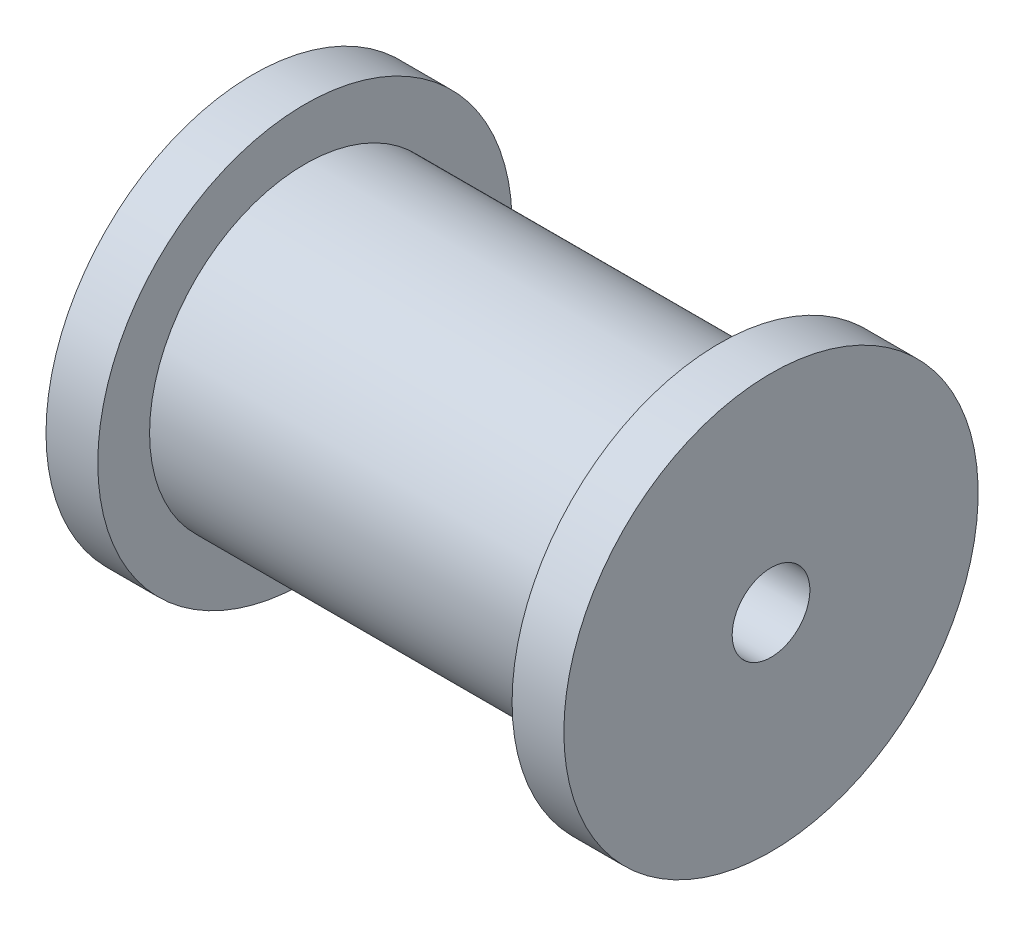
ISO-10303-21;
HEADER;
FILE_DESCRIPTION(('STEP AP214'),'2;1');
FILE_NAME('part.step','',(''),(''),'','','');
FILE_SCHEMA(('AUTOMOTIVE_DESIGN { 1 0 10303 214 1 1 1 1 }'));
ENDSEC;
DATA;
#1=APPLICATION_CONTEXT('core data for automotive mechanical design processes');
#2=APPLICATION_PROTOCOL_DEFINITION('international standard','automotive_design',2000,#1);
#3=PRODUCT_CONTEXT('',#1,'mechanical');
#4=PRODUCT('Part','Part','',(#3));
#5=PRODUCT_RELATED_PRODUCT_CATEGORY('part','',(#4));
#6=PRODUCT_DEFINITION_FORMATION('','',#4);
#7=PRODUCT_DEFINITION_CONTEXT('part definition',#1,'design');
#8=PRODUCT_DEFINITION('design','',#6,#7);
#9=PRODUCT_DEFINITION_SHAPE('','',#8);
#10=(LENGTH_UNIT() NAMED_UNIT(*) SI_UNIT(.MILLI.,.METRE.));
#11=(NAMED_UNIT(*) PLANE_ANGLE_UNIT() SI_UNIT($,.RADIAN.));
#12=(NAMED_UNIT(*) SI_UNIT($,.STERADIAN.) SOLID_ANGLE_UNIT());
#13=UNCERTAINTY_MEASURE_WITH_UNIT(LENGTH_MEASURE(1.E-05),#10,'distance_accuracy_value','');
#14=(GEOMETRIC_REPRESENTATION_CONTEXT(3) GLOBAL_UNCERTAINTY_ASSIGNED_CONTEXT((#13)) GLOBAL_UNIT_ASSIGNED_CONTEXT((#10,
#11,#12)) REPRESENTATION_CONTEXT('',''));
#15=CARTESIAN_POINT('',(0.,0.,0.));
#16=DIRECTION('',(0.,0.,1.));
#17=DIRECTION('',(1.,0.,0.));
#18=AXIS2_PLACEMENT_3D('',#15,#16,#17);
#19=CARTESIAN_POINT('',(6.35,0.,0.));
#20=DIRECTION('',(-1.,0.,0.));
#21=DIRECTION('',(0.,0.,-1.));
#22=AXIS2_PLACEMENT_3D('',#19,#20,#21);
#23=CYLINDRICAL_SURFACE('',#22,25.4);
#24=CARTESIAN_POINT('',(6.35,0.,0.));
#25=DIRECTION('',(-1.,0.,0.));
#26=DIRECTION('',(0.,0.,1.));
#27=AXIS2_PLACEMENT_3D('',#24,#25,#26);
#28=CIRCLE('',#27,25.4);
#29=CARTESIAN_POINT('',(6.35,0.,25.4));
#30=VERTEX_POINT('',#29);
#31=EDGE_CURVE('E10',#30,#30,#28,.T.);
#32=ORIENTED_EDGE('',*,*,#31,.T.);
#33=EDGE_LOOP('',(#32));
#34=FACE_BOUND('',#33,.T.);
#35=CARTESIAN_POINT('',(0.,0.,0.));
#36=DIRECTION('',(-1.,0.,0.));
#37=DIRECTION('',(0.,0.,1.));
#38=AXIS2_PLACEMENT_3D('',#35,#36,#37);
#39=CIRCLE('',#38,25.4);
#40=CARTESIAN_POINT('',(0.,0.,25.4));
#41=VERTEX_POINT('',#40);
#42=EDGE_CURVE('E34',#41,#41,#39,.T.);
#43=ORIENTED_EDGE('',*,*,#42,.F.);
#44=EDGE_LOOP('',(#43));
#45=FACE_BOUND('',#44,.T.);
#46=ADVANCED_FACE('F31',(#34,#45),#23,.T.);
#47=CARTESIAN_POINT('',(6.35,0.,0.));
#48=DIRECTION('',(1.,0.,0.));
#49=DIRECTION('',(0.,0.,1.));
#50=AXIS2_PLACEMENT_3D('',#47,#48,#49);
#51=PLANE('',#50);
#52=CARTESIAN_POINT('',(6.35,0.,0.));
#53=DIRECTION('',(-1.,0.,0.));
#54=DIRECTION('',(0.,0.,1.));
#55=AXIS2_PLACEMENT_3D('',#52,#53,#54);
#56=CIRCLE('',#55,19.05);
#57=CARTESIAN_POINT('',(6.35,0.,19.05));
#58=VERTEX_POINT('',#57);
#59=EDGE_CURVE('E43',#58,#58,#56,.T.);
#60=ORIENTED_EDGE('',*,*,#59,.T.);
#61=EDGE_LOOP('',(#60));
#62=FACE_BOUND('',#61,.T.);
#63=ORIENTED_EDGE('',*,*,#31,.F.);
#64=EDGE_LOOP('',(#63));
#65=FACE_BOUND('',#64,.T.);
#66=ADVANCED_FACE('F68',(#62,#65),#51,.T.);
#67=CARTESIAN_POINT('',(0.,0.,0.));
#68=DIRECTION('',(1.,0.,0.));
#69=DIRECTION('',(0.,0.,1.));
#70=AXIS2_PLACEMENT_3D('',#67,#68,#69);
#71=PLANE('',#70);
#72=CARTESIAN_POINT('',(0.,0.,0.));
#73=DIRECTION('',(-1.,0.,0.));
#74=DIRECTION('',(0.,0.,1.));
#75=AXIS2_PLACEMENT_3D('',#72,#73,#74);
#76=CIRCLE('',#75,4.7625);
#77=CARTESIAN_POINT('',(0.,0.,4.7625));
#78=VERTEX_POINT('',#77);
#79=EDGE_CURVE('E52',#78,#78,#76,.T.);
#80=ORIENTED_EDGE('',*,*,#79,.F.);
#81=EDGE_LOOP('',(#80));
#82=FACE_BOUND('',#81,.T.);
#83=ORIENTED_EDGE('',*,*,#42,.T.);
#84=EDGE_LOOP('',(#83));
#85=FACE_BOUND('',#84,.T.);
#86=ADVANCED_FACE('F64',(#82,#85),#71,.F.);
#87=CARTESIAN_POINT('',(57.15,0.,0.));
#88=DIRECTION('',(-1.,0.,0.));
#89=DIRECTION('',(0.,0.,-1.));
#90=AXIS2_PLACEMENT_3D('',#87,#88,#89);
#91=CYLINDRICAL_SURFACE('',#90,19.05);
#92=CARTESIAN_POINT('',(57.15,0.,0.));
#93=DIRECTION('',(-1.,0.,0.));
#94=DIRECTION('',(0.,0.,1.));
#95=AXIS2_PLACEMENT_3D('',#92,#93,#94);
#96=CIRCLE('',#95,19.05);
#97=CARTESIAN_POINT('',(57.15,0.,19.05));
#98=VERTEX_POINT('',#97);
#99=EDGE_CURVE('E41',#98,#98,#96,.T.);
#100=ORIENTED_EDGE('',*,*,#99,.T.);
#101=EDGE_LOOP('',(#100));
#102=FACE_BOUND('',#101,.T.);
#103=ORIENTED_EDGE('',*,*,#59,.F.);
#104=EDGE_LOOP('',(#103));
#105=FACE_BOUND('',#104,.T.);
#106=ADVANCED_FACE('F67',(#102,#105),#91,.T.);
#107=CARTESIAN_POINT('',(63.5,0.,0.));
#108=DIRECTION('',(-1.,0.,0.));
#109=DIRECTION('',(0.,0.,-1.));
#110=AXIS2_PLACEMENT_3D('',#107,#108,#109);
#111=CYLINDRICAL_SURFACE('',#110,25.4);
#112=CARTESIAN_POINT('',(63.5,0.,0.));
#113=DIRECTION('',(-1.,0.,0.));
#114=DIRECTION('',(0.,0.,1.));
#115=AXIS2_PLACEMENT_3D('',#112,#113,#114);
#116=CIRCLE('',#115,25.4);
#117=CARTESIAN_POINT('',(63.5,0.,25.4));
#118=VERTEX_POINT('',#117);
#119=EDGE_CURVE('E46',#118,#118,#116,.T.);
#120=ORIENTED_EDGE('',*,*,#119,.T.);
#121=EDGE_LOOP('',(#120));
#122=FACE_BOUND('',#121,.T.);
#123=CARTESIAN_POINT('',(57.15,0.,0.));
#124=DIRECTION('',(-1.,0.,0.));
#125=DIRECTION('',(0.,0.,1.));
#126=AXIS2_PLACEMENT_3D('',#123,#124,#125);
#127=CIRCLE('',#126,25.4);
#128=CARTESIAN_POINT('',(57.15,0.,25.4));
#129=VERTEX_POINT('',#128);
#130=EDGE_CURVE('E49',#129,#129,#127,.T.);
#131=ORIENTED_EDGE('',*,*,#130,.F.);
#132=EDGE_LOOP('',(#131));
#133=FACE_BOUND('',#132,.T.);
#134=ADVANCED_FACE('F83',(#122,#133),#111,.T.);
#135=CARTESIAN_POINT('',(63.5,0.,0.));
#136=DIRECTION('',(1.,0.,0.));
#137=DIRECTION('',(0.,0.,1.));
#138=AXIS2_PLACEMENT_3D('',#135,#136,#137);
#139=PLANE('',#138);
#140=CARTESIAN_POINT('',(63.5,0.,0.));
#141=DIRECTION('',(-1.,0.,0.));
#142=DIRECTION('',(0.,0.,1.));
#143=AXIS2_PLACEMENT_3D('',#140,#141,#142);
#144=CIRCLE('',#143,4.7625);
#145=CARTESIAN_POINT('',(63.5,0.,4.7625));
#146=VERTEX_POINT('',#145);
#147=EDGE_CURVE('E55',#146,#146,#144,.T.);
#148=ORIENTED_EDGE('',*,*,#147,.T.);
#149=EDGE_LOOP('',(#148));
#150=FACE_BOUND('',#149,.T.);
#151=ORIENTED_EDGE('',*,*,#119,.F.);
#152=EDGE_LOOP('',(#151));
#153=FACE_BOUND('',#152,.T.);
#154=ADVANCED_FACE('F87',(#150,#153),#139,.T.);
#155=CARTESIAN_POINT('',(57.15,0.,0.));
#156=DIRECTION('',(1.,0.,0.));
#157=DIRECTION('',(0.,0.,1.));
#158=AXIS2_PLACEMENT_3D('',#155,#156,#157);
#159=PLANE('',#158);
#160=ORIENTED_EDGE('',*,*,#99,.F.);
#161=EDGE_LOOP('',(#160));
#162=FACE_BOUND('',#161,.T.);
#163=ORIENTED_EDGE('',*,*,#130,.T.);
#164=EDGE_LOOP('',(#163));
#165=FACE_BOUND('',#164,.T.);
#166=ADVANCED_FACE('F89',(#162,#165),#159,.F.);
#167=CARTESIAN_POINT('',(0.,0.,0.));
#168=DIRECTION('',(1.,0.,0.));
#169=DIRECTION('',(0.,0.,1.));
#170=AXIS2_PLACEMENT_3D('',#167,#168,#169);
#171=CYLINDRICAL_SURFACE('',#170,4.7625);
#172=ORIENTED_EDGE('',*,*,#79,.T.);
#173=EDGE_LOOP('',(#172));
#174=FACE_BOUND('',#173,.T.);
#175=ORIENTED_EDGE('',*,*,#147,.F.);
#176=EDGE_LOOP('',(#175));
#177=FACE_BOUND('',#176,.T.);
#178=ADVANCED_FACE('F61',(#174,#177),#171,.F.);
#179=CLOSED_SHELL('',(#46,#66,#86,#106,#134,#154,#166,#178));
#180=MANIFOLD_SOLID_BREP('B2',#179);
#181=ADVANCED_BREP_SHAPE_REPRESENTATION('',(#18,#180),#14);
#182=SHAPE_DEFINITION_REPRESENTATION(#9,#181);
ENDSEC;
END-ISO-10303-21;
